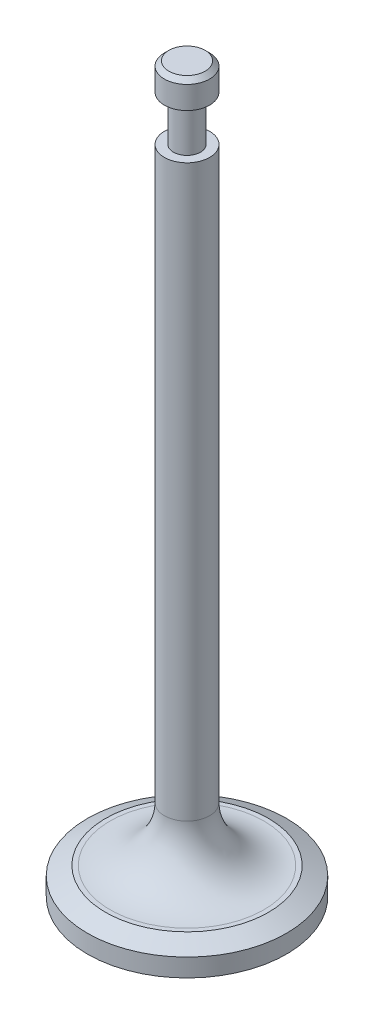
ISO-10303-21;
HEADER;
FILE_DESCRIPTION(('STEP AP214'),'2;1');
FILE_NAME('part.step','',(''),(''),'','','');
FILE_SCHEMA(('AUTOMOTIVE_DESIGN { 1 0 10303 214 1 1 1 1 }'));
ENDSEC;
DATA;
#1=APPLICATION_CONTEXT('core data for automotive mechanical design processes');
#2=APPLICATION_PROTOCOL_DEFINITION('international standard','automotive_design',2000,#1);
#3=PRODUCT_CONTEXT('',#1,'mechanical');
#4=PRODUCT('Part','Part','',(#3));
#5=PRODUCT_RELATED_PRODUCT_CATEGORY('part','',(#4));
#6=PRODUCT_DEFINITION_FORMATION('','',#4);
#7=PRODUCT_DEFINITION_CONTEXT('part definition',#1,'design');
#8=PRODUCT_DEFINITION('design','',#6,#7);
#9=PRODUCT_DEFINITION_SHAPE('','',#8);
#10=(LENGTH_UNIT() NAMED_UNIT(*) SI_UNIT(.MILLI.,.METRE.));
#11=(NAMED_UNIT(*) PLANE_ANGLE_UNIT() SI_UNIT($,.RADIAN.));
#12=(NAMED_UNIT(*) SI_UNIT($,.STERADIAN.) SOLID_ANGLE_UNIT());
#13=UNCERTAINTY_MEASURE_WITH_UNIT(LENGTH_MEASURE(1.E-05),#10,'distance_accuracy_value','');
#14=(GEOMETRIC_REPRESENTATION_CONTEXT(3) GLOBAL_UNCERTAINTY_ASSIGNED_CONTEXT((#13)) GLOBAL_UNIT_ASSIGNED_CONTEXT((#10,
#11,#12)) REPRESENTATION_CONTEXT('',''));
#15=CARTESIAN_POINT('',(0.,0.,0.));
#16=DIRECTION('',(0.,0.,1.));
#17=DIRECTION('',(1.,0.,0.));
#18=AXIS2_PLACEMENT_3D('',#15,#16,#17);
#19=CARTESIAN_POINT('',(0.,0.,-2.50000000000001));
#20=DIRECTION('',(0.,-1.,0.));
#21=DIRECTION('',(0.,0.,-1.));
#22=AXIS2_PLACEMENT_3D('',#19,#20,#21);
#23=PLANE('',#22);
#24=CARTESIAN_POINT('',(0.,0.,0.));
#25=DIRECTION('',(0.,-1.,0.));
#26=DIRECTION('',(0.,0.,-1.));
#27=AXIS2_PLACEMENT_3D('',#24,#25,#26);
#28=CIRCLE('',#27,2.00000000000005);
#29=CARTESIAN_POINT('',(0.,0.,-2.00000000000005));
#30=VERTEX_POINT('',#29);
#31=EDGE_CURVE('E51',#30,#30,#28,.F.);
#32=ORIENTED_EDGE('',*,*,#31,.T.);
#33=EDGE_LOOP('',(#32));
#34=FACE_BOUND('',#33,.T.);
#35=ADVANCED_FACE('F43',(#34),#23,.F.);
#36=CARTESIAN_POINT('',(0.,-80.,0.));
#37=DIRECTION('',(0.,1.,0.));
#38=DIRECTION('',(0.,0.,1.));
#39=AXIS2_PLACEMENT_3D('',#36,#37,#38);
#40=PLANE('',#39);
#41=CARTESIAN_POINT('',(0.,-80.,0.));
#42=DIRECTION('',(0.,1.,0.));
#43=DIRECTION('',(0.,0.,1.));
#44=AXIS2_PLACEMENT_3D('',#41,#42,#43);
#45=CIRCLE('',#44,11.);
#46=CARTESIAN_POINT('',(0.,-80.,11.));
#47=VERTEX_POINT('',#46);
#48=EDGE_CURVE('E70',#47,#47,#45,.T.);
#49=ORIENTED_EDGE('',*,*,#48,.F.);
#50=EDGE_LOOP('',(#49));
#51=FACE_BOUND('',#50,.T.);
#52=ADVANCED_FACE('F119',(#51),#40,.F.);
#53=CARTESIAN_POINT('',(0.,0.,0.));
#54=DIRECTION('',(0.,1.,0.));
#55=DIRECTION('',(0.,0.,1.));
#56=AXIS2_PLACEMENT_3D('',#53,#54,#55);
#57=CYLINDRICAL_SURFACE('',#56,11.);
#58=CARTESIAN_POINT('',(0.,-78.,0.));
#59=DIRECTION('',(0.,-1.,0.));
#60=DIRECTION('',(0.,0.,-1.));
#61=AXIS2_PLACEMENT_3D('',#58,#59,#60);
#62=CIRCLE('',#61,11.);
#63=CARTESIAN_POINT('',(0.,-78.,-11.));
#64=VERTEX_POINT('',#63);
#65=EDGE_CURVE('E55',#64,#64,#62,.T.);
#66=ORIENTED_EDGE('',*,*,#65,.T.);
#67=EDGE_LOOP('',(#66));
#68=FACE_BOUND('',#67,.T.);
#69=ORIENTED_EDGE('',*,*,#48,.T.);
#70=EDGE_LOOP('',(#69));
#71=FACE_BOUND('',#70,.T.);
#72=ADVANCED_FACE('F115',(#68,#71),#57,.T.);
#73=CARTESIAN_POINT('',(0.,-77.,-11.));
#74=DIRECTION('',(0.,-1.,0.));
#75=DIRECTION('',(0.,0.,-1.));
#76=AXIS2_PLACEMENT_3D('',#73,#74,#75);
#77=PLANE('',#76);
#78=CARTESIAN_POINT('',(0.,-77.,0.));
#79=DIRECTION('',(0.,-1.,0.));
#80=DIRECTION('',(0.,0.,-1.));
#81=AXIS2_PLACEMENT_3D('',#78,#79,#80);
#82=CIRCLE('',#81,8.99999999999993);
#83=CARTESIAN_POINT('',(0.,-77.,-8.99999999999994));
#84=VERTEX_POINT('',#83);
#85=EDGE_CURVE('E59',#84,#84,#82,.F.);
#86=ORIENTED_EDGE('',*,*,#85,.T.);
#87=EDGE_LOOP('',(#86));
#88=FACE_BOUND('',#87,.T.);
#89=CARTESIAN_POINT('',(0.,-77.,0.));
#90=DIRECTION('',(0.,-1.,0.));
#91=DIRECTION('',(0.,0.,-1.));
#92=AXIS2_PLACEMENT_3D('',#89,#90,#91);
#93=CIRCLE('',#92,8.5);
#94=CARTESIAN_POINT('',(0.,-77.,-8.50000000000001));
#95=VERTEX_POINT('',#94);
#96=EDGE_CURVE('E64',#95,#95,#93,.T.);
#97=ORIENTED_EDGE('',*,*,#96,.T.);
#98=EDGE_LOOP('',(#97));
#99=FACE_BOUND('',#98,.T.);
#100=ADVANCED_FACE('F108',(#88,#99),#77,.F.);
#101=CARTESIAN_POINT('',(0.,0.,0.));
#102=DIRECTION('',(0.,1.,0.));
#103=DIRECTION('',(0.,0.,1.));
#104=AXIS2_PLACEMENT_3D('',#101,#102,#103);
#105=CYLINDRICAL_SURFACE('',#104,2.5);
#106=CARTESIAN_POINT('',(0.,-71.,0.));
#107=DIRECTION('',(0.,-1.,0.));
#108=DIRECTION('',(0.,0.,-1.));
#109=AXIS2_PLACEMENT_3D('',#106,#107,#108);
#110=CIRCLE('',#109,2.5);
#111=CARTESIAN_POINT('',(0.,-71.,-2.50000000000001));
#112=VERTEX_POINT('',#111);
#113=EDGE_CURVE('E67',#112,#112,#110,.F.);
#114=ORIENTED_EDGE('',*,*,#113,.T.);
#115=EDGE_LOOP('',(#114));
#116=FACE_BOUND('',#115,.T.);
#117=CARTESIAN_POINT('',(0.,-8.,0.));
#118=DIRECTION('',(0.,1.,0.));
#119=DIRECTION('',(0.,0.,1.));
#120=AXIS2_PLACEMENT_3D('',#117,#118,#119);
#121=CIRCLE('',#120,2.50000000000001);
#122=CARTESIAN_POINT('',(0.,-8.,2.50000000000001));
#123=VERTEX_POINT('',#122);
#124=EDGE_CURVE('E73',#123,#123,#121,.T.);
#125=ORIENTED_EDGE('',*,*,#124,.F.);
#126=EDGE_LOOP('',(#125));
#127=FACE_BOUND('',#126,.T.);
#128=ADVANCED_FACE('F103',(#116,#127),#105,.T.);
#129=CARTESIAN_POINT('',(0.,-8.,-2.50000000000001));
#130=DIRECTION('',(0.,-1.,0.));
#131=DIRECTION('',(0.,0.,-1.));
#132=AXIS2_PLACEMENT_3D('',#129,#130,#131);
#133=PLANE('',#132);
#134=CARTESIAN_POINT('',(0.,-8.,0.));
#135=DIRECTION('',(0.,1.,0.));
#136=DIRECTION('',(0.,0.,1.));
#137=AXIS2_PLACEMENT_3D('',#134,#135,#136);
#138=CIRCLE('',#137,1.50000000000001);
#139=CARTESIAN_POINT('',(0.,-8.,1.50000000000001));
#140=VERTEX_POINT('',#139);
#141=EDGE_CURVE('E76',#140,#140,#138,.T.);
#142=ORIENTED_EDGE('',*,*,#141,.F.);
#143=EDGE_LOOP('',(#142));
#144=FACE_BOUND('',#143,.T.);
#145=ORIENTED_EDGE('',*,*,#124,.T.);
#146=EDGE_LOOP('',(#145));
#147=FACE_BOUND('',#146,.T.);
#148=ADVANCED_FACE('F97',(#144,#147),#133,.F.);
#149=CARTESIAN_POINT('',(0.,0.,0.));
#150=DIRECTION('',(0.,1.,0.));
#151=DIRECTION('',(0.,0.,1.));
#152=AXIS2_PLACEMENT_3D('',#149,#150,#151);
#153=CYLINDRICAL_SURFACE('',#152,1.50000000000001);
#154=CARTESIAN_POINT('',(0.,-3.,0.));
#155=DIRECTION('',(0.,1.,0.));
#156=DIRECTION('',(0.,0.,1.));
#157=AXIS2_PLACEMENT_3D('',#154,#155,#156);
#158=CIRCLE('',#157,1.50000000000001);
#159=CARTESIAN_POINT('',(0.,-3.,1.50000000000001));
#160=VERTEX_POINT('',#159);
#161=EDGE_CURVE('E79',#160,#160,#158,.T.);
#162=ORIENTED_EDGE('',*,*,#161,.F.);
#163=EDGE_LOOP('',(#162));
#164=FACE_BOUND('',#163,.T.);
#165=ORIENTED_EDGE('',*,*,#141,.T.);
#166=EDGE_LOOP('',(#165));
#167=FACE_BOUND('',#166,.T.);
#168=ADVANCED_FACE('F91',(#164,#167),#153,.T.);
#169=CARTESIAN_POINT('',(0.,-3.,-1.50000000000001));
#170=DIRECTION('',(0.,1.,0.));
#171=DIRECTION('',(0.,0.,1.));
#172=AXIS2_PLACEMENT_3D('',#169,#170,#171);
#173=PLANE('',#172);
#174=CARTESIAN_POINT('',(0.,-3.,0.));
#175=DIRECTION('',(0.,1.,0.));
#176=DIRECTION('',(0.,0.,1.));
#177=AXIS2_PLACEMENT_3D('',#174,#175,#176);
#178=CIRCLE('',#177,2.50000000000001);
#179=CARTESIAN_POINT('',(0.,-3.,2.50000000000001));
#180=VERTEX_POINT('',#179);
#181=EDGE_CURVE('E82',#180,#180,#178,.T.);
#182=ORIENTED_EDGE('',*,*,#181,.F.);
#183=EDGE_LOOP('',(#182));
#184=FACE_BOUND('',#183,.T.);
#185=ORIENTED_EDGE('',*,*,#161,.T.);
#186=EDGE_LOOP('',(#185));
#187=FACE_BOUND('',#186,.T.);
#188=ADVANCED_FACE('F88',(#184,#187),#173,.F.);
#189=CARTESIAN_POINT('',(0.,0.,0.));
#190=DIRECTION('',(0.,1.,0.));
#191=DIRECTION('',(0.,0.,1.));
#192=AXIS2_PLACEMENT_3D('',#189,#190,#191);
#193=CYLINDRICAL_SURFACE('',#192,2.50000000000001);
#194=CARTESIAN_POINT('',(0.,-0.499999999999964,0.));
#195=DIRECTION('',(0.,-1.,0.));
#196=DIRECTION('',(0.,0.,-1.));
#197=AXIS2_PLACEMENT_3D('',#194,#195,#196);
#198=CIRCLE('',#197,2.50000000000001);
#199=CARTESIAN_POINT('',(0.,-0.499999999999963,-2.50000000000001));
#200=VERTEX_POINT('',#199);
#201=EDGE_CURVE('E10',#200,#200,#198,.T.);
#202=ORIENTED_EDGE('',*,*,#201,.T.);
#203=EDGE_LOOP('',(#202));
#204=FACE_BOUND('',#203,.T.);
#205=ORIENTED_EDGE('',*,*,#181,.T.);
#206=EDGE_LOOP('',(#205));
#207=FACE_BOUND('',#206,.T.);
#208=ADVANCED_FACE('F86',(#204,#207),#193,.T.);
#209=CARTESIAN_POINT('',(0.,-71.,0.));
#210=DIRECTION('',(0.,-1.,0.));
#211=DIRECTION('',(0.,0.,-1.));
#212=AXIS2_PLACEMENT_3D('',#209,#210,#211);
#213=TOROIDAL_SURFACE('',#212,8.5,6.);
#214=ORIENTED_EDGE('',*,*,#96,.F.);
#215=EDGE_LOOP('',(#214));
#216=FACE_BOUND('',#215,.T.);
#217=ORIENTED_EDGE('',*,*,#113,.F.);
#218=EDGE_LOOP('',(#217));
#219=FACE_BOUND('',#218,.T.);
#220=ADVANCED_FACE('F130',(#216,#219),#213,.F.);
#221=CARTESIAN_POINT('',(0.,-77.,0.));
#222=DIRECTION('',(0.,-1.,0.));
#223=DIRECTION('',(0.,0.,-1.));
#224=AXIS2_PLACEMENT_3D('',#221,#222,#223);
#225=CONICAL_SURFACE('',#224,8.99999999999993,1.10714871779409);
#226=ORIENTED_EDGE('',*,*,#65,.F.);
#227=EDGE_LOOP('',(#226));
#228=FACE_BOUND('',#227,.T.);
#229=ORIENTED_EDGE('',*,*,#85,.F.);
#230=EDGE_LOOP('',(#229));
#231=FACE_BOUND('',#230,.T.);
#232=ADVANCED_FACE('F131',(#228,#231),#225,.T.);
#233=CARTESIAN_POINT('',(0.,0.,0.));
#234=DIRECTION('',(0.,-1.,0.));
#235=DIRECTION('',(0.,0.,-1.));
#236=AXIS2_PLACEMENT_3D('',#233,#234,#235);
#237=CONICAL_SURFACE('',#236,2.00000000000005,0.785398163397446);
#238=ORIENTED_EDGE('',*,*,#201,.F.);
#239=EDGE_LOOP('',(#238));
#240=FACE_BOUND('',#239,.T.);
#241=ORIENTED_EDGE('',*,*,#31,.F.);
#242=EDGE_LOOP('',(#241));
#243=FACE_BOUND('',#242,.T.);
#244=ADVANCED_FACE('F46',(#240,#243),#237,.T.);
#245=CLOSED_SHELL('',(#35,#52,#72,#100,#128,#148,#168,#188,#208,#220,#232,#244));
#246=MANIFOLD_SOLID_BREP('B2',#245);
#247=ADVANCED_BREP_SHAPE_REPRESENTATION('',(#18,#246),#14);
#248=SHAPE_DEFINITION_REPRESENTATION(#9,#247);
ENDSEC;
END-ISO-10303-21;
